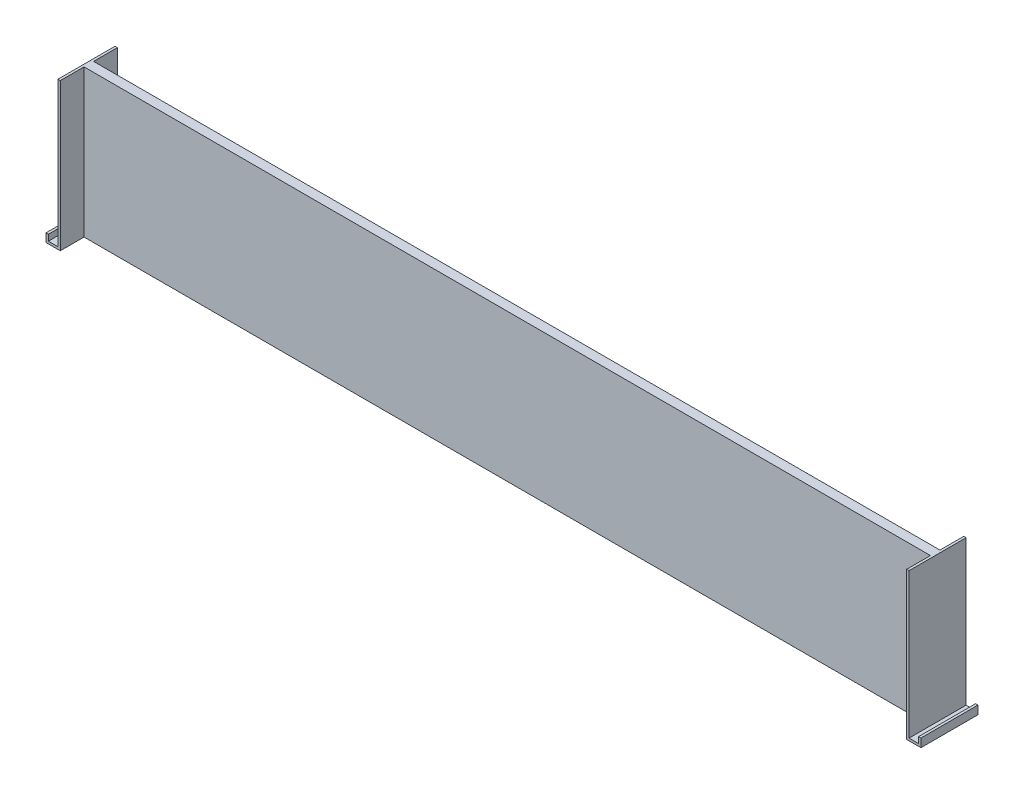
ISO-10303-21;
HEADER;
FILE_DESCRIPTION(('STEP AP214'),'2;1');
FILE_NAME('part.step','',(''),(''),'','','');
FILE_SCHEMA(('AUTOMOTIVE_DESIGN { 1 0 10303 214 1 1 1 1 }'));
ENDSEC;
DATA;
#1=APPLICATION_CONTEXT('core data for automotive mechanical design processes');
#2=APPLICATION_PROTOCOL_DEFINITION('international standard','automotive_design',2000,#1);
#3=PRODUCT_CONTEXT('',#1,'mechanical');
#4=PRODUCT('Part','Part','',(#3));
#5=PRODUCT_RELATED_PRODUCT_CATEGORY('part','',(#4));
#6=PRODUCT_DEFINITION_FORMATION('','',#4);
#7=PRODUCT_DEFINITION_CONTEXT('part definition',#1,'design');
#8=PRODUCT_DEFINITION('design','',#6,#7);
#9=PRODUCT_DEFINITION_SHAPE('','',#8);
#10=(LENGTH_UNIT() NAMED_UNIT(*) SI_UNIT(.MILLI.,.METRE.));
#11=(NAMED_UNIT(*) PLANE_ANGLE_UNIT() SI_UNIT($,.RADIAN.));
#12=(NAMED_UNIT(*) SI_UNIT($,.STERADIAN.) SOLID_ANGLE_UNIT());
#13=UNCERTAINTY_MEASURE_WITH_UNIT(LENGTH_MEASURE(1.E-05),#10,'distance_accuracy_value','');
#14=(GEOMETRIC_REPRESENTATION_CONTEXT(3) GLOBAL_UNCERTAINTY_ASSIGNED_CONTEXT((#13)) GLOBAL_UNIT_ASSIGNED_CONTEXT((#10,
#11,#12)) REPRESENTATION_CONTEXT('',''));
#15=CARTESIAN_POINT('',(0.,0.,0.));
#16=DIRECTION('',(0.,0.,1.));
#17=DIRECTION('',(1.,0.,0.));
#18=AXIS2_PLACEMENT_3D('',#15,#16,#17);
#19=CARTESIAN_POINT('',(-4.7625,49.2125,0.));
#20=DIRECTION('',(-1.,0.,0.));
#21=DIRECTION('',(0.,0.,1.));
#22=AXIS2_PLACEMENT_3D('',#19,#20,#21);
#23=PLANE('',#22);
#24=DIRECTION('',(0.,0.,1.));
#25=VECTOR('',#24,1.);
#26=CARTESIAN_POINT('',(-4.7625,2.8185133302467,-11.1125));
#27=LINE('',#26,#25);
#28=CARTESIAN_POINT('',(-4.7625,2.8185133302467,-11.1125));
#29=VERTEX_POINT('',#28);
#30=CARTESIAN_POINT('',(-4.7625,2.8185133302467,7.9375));
#31=VERTEX_POINT('',#30);
#32=EDGE_CURVE('E230',#29,#31,#27,.T.);
#33=ORIENTED_EDGE('',*,*,#32,.F.);
#34=DIRECTION('',(0.,-1.,0.));
#35=VECTOR('',#34,1.);
#36=CARTESIAN_POINT('',(-4.7625,49.2125,-11.1125));
#37=LINE('',#36,#35);
#38=CARTESIAN_POINT('',(-4.7625,0.,-11.1125));
#39=VERTEX_POINT('',#38);
#40=EDGE_CURVE('E243',#29,#39,#37,.T.);
#41=ORIENTED_EDGE('',*,*,#40,.T.);
#42=DIRECTION('',(0.,0.,-1.));
#43=VECTOR('',#42,1.);
#44=CARTESIAN_POINT('',(-4.7625,0.,0.));
#45=LINE('',#44,#43);
#46=CARTESIAN_POINT('',(-4.7625,0.,7.9375));
#47=VERTEX_POINT('',#46);
#48=EDGE_CURVE('E337',#47,#39,#45,.T.);
#49=ORIENTED_EDGE('',*,*,#48,.F.);
#50=DIRECTION('',(0.,-1.,0.));
#51=VECTOR('',#50,1.);
#52=CARTESIAN_POINT('',(-4.7625,49.2125,7.9375));
#53=LINE('',#52,#51);
#54=EDGE_CURVE('E245',#31,#47,#53,.T.);
#55=ORIENTED_EDGE('',*,*,#54,.F.);
#56=EDGE_LOOP('',(#33,#41,#49,#55));
#57=FACE_BOUND('',#56,.T.);
#58=ADVANCED_FACE('F89',(#57),#23,.T.);
#59=CARTESIAN_POINT('',(0.,49.2125,7.9375));
#60=DIRECTION('',(0.,0.,1.));
#61=DIRECTION('',(1.,0.,0.));
#62=AXIS2_PLACEMENT_3D('',#59,#60,#61);
#63=PLANE('',#62);
#64=DIRECTION('',(0.,1.,0.));
#65=VECTOR('',#64,1.);
#66=CARTESIAN_POINT('',(-0.79375,0.793749999999999,7.9375));
#67=LINE('',#66,#65);
#68=CARTESIAN_POINT('',(-0.79375,0.793749999999999,7.9375));
#69=VERTEX_POINT('',#68);
#70=CARTESIAN_POINT('',(-0.79375,49.2125,7.9375));
#71=VERTEX_POINT('',#70);
#72=EDGE_CURVE('E106',#69,#71,#67,.T.);
#73=ORIENTED_EDGE('',*,*,#72,.F.);
#74=DIRECTION('',(1.,0.,0.));
#75=VECTOR('',#74,1.);
#76=CARTESIAN_POINT('',(-3.96875,0.793749999999999,7.9375));
#77=LINE('',#76,#75);
#78=CARTESIAN_POINT('',(-3.96875,0.793749999999999,7.9375));
#79=VERTEX_POINT('',#78);
#80=EDGE_CURVE('E490',#79,#69,#77,.T.);
#81=ORIENTED_EDGE('',*,*,#80,.F.);
#82=DIRECTION('',(0.,-1.,0.));
#83=VECTOR('',#82,1.);
#84=CARTESIAN_POINT('',(-3.96875,2.8185133302467,7.9375));
#85=LINE('',#84,#83);
#86=CARTESIAN_POINT('',(-3.96875,2.8185133302467,7.9375));
#87=VERTEX_POINT('',#86);
#88=EDGE_CURVE('E494',#87,#79,#85,.T.);
#89=ORIENTED_EDGE('',*,*,#88,.F.);
#90=DIRECTION('',(1.,0.,0.));
#91=VECTOR('',#90,1.);
#92=CARTESIAN_POINT('',(-4.7625,2.8185133302467,7.9375));
#93=LINE('',#92,#91);
#94=EDGE_CURVE('E449',#31,#87,#93,.T.);
#95=ORIENTED_EDGE('',*,*,#94,.F.);
#96=ORIENTED_EDGE('',*,*,#54,.T.);
#97=DIRECTION('',(-1.,0.,0.));
#98=VECTOR('',#97,1.);
#99=CARTESIAN_POINT('',(0.,0.,7.9375));
#100=LINE('',#99,#98);
#101=CARTESIAN_POINT('',(0.,0.,7.9375));
#102=VERTEX_POINT('',#101);
#103=EDGE_CURVE('E341',#102,#47,#100,.T.);
#104=ORIENTED_EDGE('',*,*,#103,.F.);
#105=DIRECTION('',(0.,-1.,0.));
#106=VECTOR('',#105,1.);
#107=CARTESIAN_POINT('',(0.,49.2125,7.9375));
#108=LINE('',#107,#106);
#109=CARTESIAN_POINT('',(0.,49.2125,7.9375));
#110=VERTEX_POINT('',#109);
#111=EDGE_CURVE('E261',#110,#102,#108,.T.);
#112=ORIENTED_EDGE('',*,*,#111,.F.);
#113=DIRECTION('',(-1.,0.,0.));
#114=VECTOR('',#113,1.);
#115=CARTESIAN_POINT('',(0.,49.2125,7.9375));
#116=LINE('',#115,#114);
#117=EDGE_CURVE('E356',#110,#71,#116,.T.);
#118=ORIENTED_EDGE('',*,*,#117,.T.);
#119=EDGE_LOOP('',(#73,#81,#89,#95,#96,#104,#112,#118));
#120=FACE_BOUND('',#119,.T.);
#121=ADVANCED_FACE('F374',(#120),#63,.T.);
#122=CARTESIAN_POINT('',(0.,49.2125,-11.1125));
#123=DIRECTION('',(0.,0.,1.));
#124=DIRECTION('',(1.,0.,0.));
#125=AXIS2_PLACEMENT_3D('',#122,#123,#124);
#126=PLANE('',#125);
#127=DIRECTION('',(1.,0.,0.));
#128=VECTOR('',#127,1.);
#129=CARTESIAN_POINT('',(-3.96875,0.793749999999999,-11.1125));
#130=LINE('',#129,#128);
#131=CARTESIAN_POINT('',(-3.96875,0.793749999999999,-11.1125));
#132=VERTEX_POINT('',#131);
#133=CARTESIAN_POINT('',(-0.79375,0.793749999999999,-11.1125));
#134=VERTEX_POINT('',#133);
#135=EDGE_CURVE('E502',#132,#134,#130,.T.);
#136=ORIENTED_EDGE('',*,*,#135,.T.);
#137=DIRECTION('',(0.,1.,0.));
#138=VECTOR('',#137,1.);
#139=CARTESIAN_POINT('',(-0.79375,0.793749999999999,-11.1125));
#140=LINE('',#139,#138);
#141=CARTESIAN_POINT('',(-0.79375,49.2125,-11.1125));
#142=VERTEX_POINT('',#141);
#143=EDGE_CURVE('E247',#134,#142,#140,.T.);
#144=ORIENTED_EDGE('',*,*,#143,.T.);
#145=DIRECTION('',(-1.,0.,0.));
#146=VECTOR('',#145,1.);
#147=CARTESIAN_POINT('',(0.,49.2125,-11.1125));
#148=LINE('',#147,#146);
#149=CARTESIAN_POINT('',(0.,49.2125,-11.1125));
#150=VERTEX_POINT('',#149);
#151=EDGE_CURVE('E257',#150,#142,#148,.T.);
#152=ORIENTED_EDGE('',*,*,#151,.F.);
#153=DIRECTION('',(0.,-1.,0.));
#154=VECTOR('',#153,1.);
#155=CARTESIAN_POINT('',(0.,49.2125,-11.1125));
#156=LINE('',#155,#154);
#157=CARTESIAN_POINT('',(0.,0.,-11.1125));
#158=VERTEX_POINT('',#157);
#159=EDGE_CURVE('E256',#150,#158,#156,.T.);
#160=ORIENTED_EDGE('',*,*,#159,.T.);
#161=DIRECTION('',(-1.,0.,0.));
#162=VECTOR('',#161,1.);
#163=CARTESIAN_POINT('',(0.,0.,-11.1125));
#164=LINE('',#163,#162);
#165=EDGE_CURVE('E253',#158,#39,#164,.T.);
#166=ORIENTED_EDGE('',*,*,#165,.T.);
#167=ORIENTED_EDGE('',*,*,#40,.F.);
#168=DIRECTION('',(1.,0.,0.));
#169=VECTOR('',#168,1.);
#170=CARTESIAN_POINT('',(-4.7625,2.8185133302467,-11.1125));
#171=LINE('',#170,#169);
#172=CARTESIAN_POINT('',(-3.96875,2.8185133302467,-11.1125));
#173=VERTEX_POINT('',#172);
#174=EDGE_CURVE('E226',#29,#173,#171,.T.);
#175=ORIENTED_EDGE('',*,*,#174,.T.);
#176=DIRECTION('',(0.,-1.,0.));
#177=VECTOR('',#176,1.);
#178=CARTESIAN_POINT('',(-3.96875,2.8185133302467,-11.1125));
#179=LINE('',#178,#177);
#180=EDGE_CURVE('E238',#173,#132,#179,.T.);
#181=ORIENTED_EDGE('',*,*,#180,.T.);
#182=EDGE_LOOP('',(#136,#144,#152,#160,#166,#167,#175,#181));
#183=FACE_BOUND('',#182,.T.);
#184=ADVANCED_FACE('F250',(#183),#126,.F.);
#185=CARTESIAN_POINT('',(0.,0.,0.));
#186=DIRECTION('',(0.,1.,0.));
#187=DIRECTION('',(0.,0.,1.));
#188=AXIS2_PLACEMENT_3D('',#185,#186,#187);
#189=PLANE('',#188);
#190=ORIENTED_EDGE('',*,*,#48,.T.);
#191=ORIENTED_EDGE('',*,*,#165,.F.);
#192=DIRECTION('',(0.,0.,-1.));
#193=VECTOR('',#192,1.);
#194=CARTESIAN_POINT('',(0.,0.,0.));
#195=LINE('',#194,#193);
#196=CARTESIAN_POINT('',(0.,0.,-3.175));
#197=VERTEX_POINT('',#196);
#198=EDGE_CURVE('E346',#197,#158,#195,.T.);
#199=ORIENTED_EDGE('',*,*,#198,.F.);
#200=DIRECTION('',(1.,0.,0.));
#201=VECTOR('',#200,1.);
#202=CARTESIAN_POINT('',(0.,0.,-3.175));
#203=LINE('',#202,#201);
#204=CARTESIAN_POINT('',(282.575,0.,-3.175));
#205=VERTEX_POINT('',#204);
#206=EDGE_CURVE('E326',#197,#205,#203,.T.);
#207=ORIENTED_EDGE('',*,*,#206,.T.);
#208=DIRECTION('',(0.,0.,-1.));
#209=VECTOR('',#208,1.);
#210=CARTESIAN_POINT('',(282.575,0.,0.));
#211=LINE('',#210,#209);
#212=CARTESIAN_POINT('',(282.575,0.,-11.1125));
#213=VERTEX_POINT('',#212);
#214=EDGE_CURVE('E301',#205,#213,#211,.T.);
#215=ORIENTED_EDGE('',*,*,#214,.T.);
#216=DIRECTION('',(1.,0.,0.));
#217=VECTOR('',#216,1.);
#218=CARTESIAN_POINT('',(0.,0.,-11.1125));
#219=LINE('',#218,#217);
#220=CARTESIAN_POINT('',(287.3375,0.,-11.1125));
#221=VERTEX_POINT('',#220);
#222=EDGE_CURVE('E297',#213,#221,#219,.T.);
#223=ORIENTED_EDGE('',*,*,#222,.T.);
#224=DIRECTION('',(0.,0.,-1.));
#225=VECTOR('',#224,1.);
#226=CARTESIAN_POINT('',(287.3375,0.,0.));
#227=LINE('',#226,#225);
#228=CARTESIAN_POINT('',(287.3375,0.,7.9375));
#229=VERTEX_POINT('',#228);
#230=EDGE_CURVE('E292',#229,#221,#227,.T.);
#231=ORIENTED_EDGE('',*,*,#230,.F.);
#232=DIRECTION('',(1.,0.,0.));
#233=VECTOR('',#232,1.);
#234=CARTESIAN_POINT('',(0.,0.,7.9375));
#235=LINE('',#234,#233);
#236=CARTESIAN_POINT('',(282.575,0.,7.9375));
#237=VERTEX_POINT('',#236);
#238=EDGE_CURVE('E288',#237,#229,#235,.T.);
#239=ORIENTED_EDGE('',*,*,#238,.F.);
#240=CARTESIAN_POINT('',(282.575,0.,0.));
#241=VERTEX_POINT('',#240);
#242=EDGE_CURVE('E278',#237,#241,#211,.T.);
#243=ORIENTED_EDGE('',*,*,#242,.T.);
#244=DIRECTION('',(1.,0.,0.));
#245=VECTOR('',#244,1.);
#246=CARTESIAN_POINT('',(0.,0.,0.));
#247=LINE('',#246,#245);
#248=CARTESIAN_POINT('',(0.,0.,0.));
#249=VERTEX_POINT('',#248);
#250=EDGE_CURVE('E322',#249,#241,#247,.T.);
#251=ORIENTED_EDGE('',*,*,#250,.F.);
#252=EDGE_CURVE('E349',#102,#249,#195,.T.);
#253=ORIENTED_EDGE('',*,*,#252,.F.);
#254=ORIENTED_EDGE('',*,*,#103,.T.);
#255=EDGE_LOOP('',(#190,#191,#199,#207,#215,#223,#231,#239,#243,#251,#253,#254));
#256=FACE_BOUND('',#255,.T.);
#257=ADVANCED_FACE('F364',(#256),#189,.F.);
#258=CARTESIAN_POINT('',(0.,49.2125,0.));
#259=DIRECTION('',(0.,1.,0.));
#260=DIRECTION('',(0.,0.,1.));
#261=AXIS2_PLACEMENT_3D('',#258,#259,#260);
#262=PLANE('',#261);
#263=DIRECTION('',(0.,0.,1.));
#264=VECTOR('',#263,1.);
#265=CARTESIAN_POINT('',(-0.79375,49.2125,-11.1125));
#266=LINE('',#265,#264);
#267=EDGE_CURVE('E330',#142,#71,#266,.T.);
#268=ORIENTED_EDGE('',*,*,#267,.T.);
#269=ORIENTED_EDGE('',*,*,#117,.F.);
#270=DIRECTION('',(0.,0.,-1.));
#271=VECTOR('',#270,1.);
#272=CARTESIAN_POINT('',(0.,49.2125,0.));
#273=LINE('',#272,#271);
#274=CARTESIAN_POINT('',(0.,49.2125,0.));
#275=VERTEX_POINT('',#274);
#276=EDGE_CURVE('E264',#110,#275,#273,.T.);
#277=ORIENTED_EDGE('',*,*,#276,.T.);
#278=DIRECTION('',(1.,0.,0.));
#279=VECTOR('',#278,1.);
#280=CARTESIAN_POINT('',(0.,49.2125,0.));
#281=LINE('',#280,#279);
#282=CARTESIAN_POINT('',(282.575,49.2125,0.));
#283=VERTEX_POINT('',#282);
#284=EDGE_CURVE('E293',#275,#283,#281,.T.);
#285=ORIENTED_EDGE('',*,*,#284,.T.);
#286=DIRECTION('',(0.,0.,-1.));
#287=VECTOR('',#286,1.);
#288=CARTESIAN_POINT('',(282.575,49.2125,0.));
#289=LINE('',#288,#287);
#290=CARTESIAN_POINT('',(282.575,49.2125,7.9375));
#291=VERTEX_POINT('',#290);
#292=EDGE_CURVE('E283',#291,#283,#289,.T.);
#293=ORIENTED_EDGE('',*,*,#292,.F.);
#294=DIRECTION('',(1.,0.,0.));
#295=VECTOR('',#294,1.);
#296=CARTESIAN_POINT('',(0.,49.2125,7.9375));
#297=LINE('',#296,#295);
#298=CARTESIAN_POINT('',(283.36875,49.2125,7.9375));
#299=VERTEX_POINT('',#298);
#300=EDGE_CURVE('E273',#291,#299,#297,.T.);
#301=ORIENTED_EDGE('',*,*,#300,.T.);
#302=DIRECTION('',(0.,0.,1.));
#303=VECTOR('',#302,1.);
#304=CARTESIAN_POINT('',(283.36875,49.2125,-11.1125));
#305=LINE('',#304,#303);
#306=CARTESIAN_POINT('',(283.36875,49.2125,-11.1125));
#307=VERTEX_POINT('',#306);
#308=EDGE_CURVE('E432',#307,#299,#305,.T.);
#309=ORIENTED_EDGE('',*,*,#308,.F.);
#310=DIRECTION('',(1.,0.,0.));
#311=VECTOR('',#310,1.);
#312=CARTESIAN_POINT('',(0.,49.2125,-11.1125));
#313=LINE('',#312,#311);
#314=CARTESIAN_POINT('',(282.575,49.2125,-11.1125));
#315=VERTEX_POINT('',#314);
#316=EDGE_CURVE('E277',#315,#307,#313,.T.);
#317=ORIENTED_EDGE('',*,*,#316,.F.);
#318=CARTESIAN_POINT('',(282.575,49.2125,-3.175));
#319=VERTEX_POINT('',#318);
#320=EDGE_CURVE('E282',#319,#315,#289,.T.);
#321=ORIENTED_EDGE('',*,*,#320,.F.);
#322=DIRECTION('',(1.,0.,0.));
#323=VECTOR('',#322,1.);
#324=CARTESIAN_POINT('',(0.,49.2125,-3.175));
#325=LINE('',#324,#323);
#326=CARTESIAN_POINT('',(0.,49.2125,-3.175));
#327=VERTEX_POINT('',#326);
#328=EDGE_CURVE('E318',#327,#319,#325,.T.);
#329=ORIENTED_EDGE('',*,*,#328,.F.);
#330=EDGE_CURVE('E427',#327,#150,#273,.T.);
#331=ORIENTED_EDGE('',*,*,#330,.T.);
#332=ORIENTED_EDGE('',*,*,#151,.T.);
#333=EDGE_LOOP('',(#268,#269,#277,#285,#293,#301,#309,#317,#321,#329,#331,#332));
#334=FACE_BOUND('',#333,.T.);
#335=ADVANCED_FACE('F366',(#334),#262,.T.);
#336=CARTESIAN_POINT('',(0.,49.2125,0.));
#337=DIRECTION('',(-1.,0.,0.));
#338=DIRECTION('',(0.,0.,1.));
#339=AXIS2_PLACEMENT_3D('',#336,#337,#338);
#340=PLANE('',#339);
#341=ORIENTED_EDGE('',*,*,#330,.F.);
#342=DIRECTION('',(0.,-1.,0.));
#343=VECTOR('',#342,1.);
#344=CARTESIAN_POINT('',(0.,49.2125,-3.175));
#345=LINE('',#344,#343);
#346=EDGE_CURVE('E93',#327,#197,#345,.T.);
#347=ORIENTED_EDGE('',*,*,#346,.T.);
#348=ORIENTED_EDGE('',*,*,#198,.T.);
#349=ORIENTED_EDGE('',*,*,#159,.F.);
#350=EDGE_LOOP('',(#341,#347,#348,#349));
#351=FACE_BOUND('',#350,.T.);
#352=ADVANCED_FACE('F361',(#351),#340,.F.);
#353=DIRECTION('',(0.,-1.,0.));
#354=VECTOR('',#353,1.);
#355=CARTESIAN_POINT('',(0.,49.2125,0.));
#356=LINE('',#355,#354);
#357=EDGE_CURVE('E12',#275,#249,#356,.T.);
#358=ORIENTED_EDGE('',*,*,#357,.F.);
#359=ORIENTED_EDGE('',*,*,#276,.F.);
#360=ORIENTED_EDGE('',*,*,#111,.T.);
#361=ORIENTED_EDGE('',*,*,#252,.T.);
#362=EDGE_LOOP('',(#358,#359,#360,#361));
#363=FACE_BOUND('',#362,.T.);
#364=ADVANCED_FACE('F399',(#363),#340,.F.);
#365=CARTESIAN_POINT('',(287.3375,49.2125,0.));
#366=DIRECTION('',(-1.,0.,0.));
#367=DIRECTION('',(0.,0.,1.));
#368=AXIS2_PLACEMENT_3D('',#365,#366,#367);
#369=PLANE('',#368);
#370=DIRECTION('',(0.,-1.,0.));
#371=VECTOR('',#370,1.);
#372=CARTESIAN_POINT('',(287.3375,49.2125,-11.1125));
#373=LINE('',#372,#371);
#374=CARTESIAN_POINT('',(287.3375,2.8185133302467,-11.1125));
#375=VERTEX_POINT('',#374);
#376=EDGE_CURVE('E311',#375,#221,#373,.T.);
#377=ORIENTED_EDGE('',*,*,#376,.F.);
#378=DIRECTION('',(0.,0.,1.));
#379=VECTOR('',#378,1.);
#380=CARTESIAN_POINT('',(287.3375,2.8185133302467,-11.1125));
#381=LINE('',#380,#379);
#382=CARTESIAN_POINT('',(287.3375,2.8185133302467,7.9375));
#383=VERTEX_POINT('',#382);
#384=EDGE_CURVE('E445',#375,#383,#381,.T.);
#385=ORIENTED_EDGE('',*,*,#384,.T.);
#386=DIRECTION('',(0.,-1.,0.));
#387=VECTOR('',#386,1.);
#388=CARTESIAN_POINT('',(287.3375,49.2125,7.9375));
#389=LINE('',#388,#387);
#390=EDGE_CURVE('E314',#383,#229,#389,.T.);
#391=ORIENTED_EDGE('',*,*,#390,.T.);
#392=ORIENTED_EDGE('',*,*,#230,.T.);
#393=EDGE_LOOP('',(#377,#385,#391,#392));
#394=FACE_BOUND('',#393,.T.);
#395=ADVANCED_FACE('F396',(#394),#369,.F.);
#396=CARTESIAN_POINT('',(0.,49.2125,7.9375));
#397=DIRECTION('',(0.,0.,-1.));
#398=DIRECTION('',(-1.,0.,0.));
#399=AXIS2_PLACEMENT_3D('',#396,#397,#398);
#400=PLANE('',#399);
#401=ORIENTED_EDGE('',*,*,#390,.F.);
#402=DIRECTION('',(1.,0.,0.));
#403=VECTOR('',#402,1.);
#404=CARTESIAN_POINT('',(287.3375,2.8185133302467,7.9375));
#405=LINE('',#404,#403);
#406=CARTESIAN_POINT('',(286.54375,2.8185133302467,7.9375));
#407=VERTEX_POINT('',#406);
#408=EDGE_CURVE('E450',#407,#383,#405,.T.);
#409=ORIENTED_EDGE('',*,*,#408,.F.);
#410=DIRECTION('',(0.,1.,0.));
#411=VECTOR('',#410,1.);
#412=CARTESIAN_POINT('',(286.54375,2.8185133302467,7.9375));
#413=LINE('',#412,#411);
#414=CARTESIAN_POINT('',(286.54375,0.793750000000007,7.9375));
#415=VERTEX_POINT('',#414);
#416=EDGE_CURVE('E454',#415,#407,#413,.T.);
#417=ORIENTED_EDGE('',*,*,#416,.F.);
#418=DIRECTION('',(1.,0.,0.));
#419=VECTOR('',#418,1.);
#420=CARTESIAN_POINT('',(286.54375,0.793750000000007,7.9375));
#421=LINE('',#420,#419);
#422=CARTESIAN_POINT('',(283.36875,0.793750000000007,7.9375));
#423=VERTEX_POINT('',#422);
#424=EDGE_CURVE('E458',#423,#415,#421,.T.);
#425=ORIENTED_EDGE('',*,*,#424,.F.);
#426=DIRECTION('',(0.,-1.,0.));
#427=VECTOR('',#426,1.);
#428=CARTESIAN_POINT('',(283.36875,0.793750000000007,7.9375));
#429=LINE('',#428,#427);
#430=EDGE_CURVE('E462',#299,#423,#429,.T.);
#431=ORIENTED_EDGE('',*,*,#430,.F.);
#432=ORIENTED_EDGE('',*,*,#300,.F.);
#433=DIRECTION('',(0.,-1.,0.));
#434=VECTOR('',#433,1.);
#435=CARTESIAN_POINT('',(282.575,49.2125,7.9375));
#436=LINE('',#435,#434);
#437=EDGE_CURVE('E287',#291,#237,#436,.T.);
#438=ORIENTED_EDGE('',*,*,#437,.T.);
#439=ORIENTED_EDGE('',*,*,#238,.T.);
#440=EDGE_LOOP('',(#401,#409,#417,#425,#431,#432,#438,#439));
#441=FACE_BOUND('',#440,.T.);
#442=ADVANCED_FACE('F394',(#441),#400,.F.);
#443=CARTESIAN_POINT('',(0.,49.2125,-11.1125));
#444=DIRECTION('',(0.,0.,-1.));
#445=DIRECTION('',(-1.,0.,0.));
#446=AXIS2_PLACEMENT_3D('',#443,#444,#445);
#447=PLANE('',#446);
#448=DIRECTION('',(1.,0.,0.));
#449=VECTOR('',#448,1.);
#450=CARTESIAN_POINT('',(287.3375,2.8185133302467,-11.1125));
#451=LINE('',#450,#449);
#452=CARTESIAN_POINT('',(286.54375,2.8185133302467,-11.1125));
#453=VERTEX_POINT('',#452);
#454=EDGE_CURVE('E436',#453,#375,#451,.T.);
#455=ORIENTED_EDGE('',*,*,#454,.T.);
#456=ORIENTED_EDGE('',*,*,#376,.T.);
#457=ORIENTED_EDGE('',*,*,#222,.F.);
#458=DIRECTION('',(0.,-1.,0.));
#459=VECTOR('',#458,1.);
#460=CARTESIAN_POINT('',(282.575,49.2125,-11.1125));
#461=LINE('',#460,#459);
#462=EDGE_CURVE('E307',#315,#213,#461,.T.);
#463=ORIENTED_EDGE('',*,*,#462,.F.);
#464=ORIENTED_EDGE('',*,*,#316,.T.);
#465=DIRECTION('',(0.,-1.,0.));
#466=VECTOR('',#465,1.);
#467=CARTESIAN_POINT('',(283.36875,0.793750000000007,-11.1125));
#468=LINE('',#467,#466);
#469=CARTESIAN_POINT('',(283.36875,0.79375000000001,-11.1125));
#470=VERTEX_POINT('',#469);
#471=EDGE_CURVE('E453',#307,#470,#468,.T.);
#472=ORIENTED_EDGE('',*,*,#471,.T.);
#473=DIRECTION('',(1.,0.,0.));
#474=VECTOR('',#473,1.);
#475=CARTESIAN_POINT('',(286.54375,0.793750000000007,-11.1125));
#476=LINE('',#475,#474);
#477=CARTESIAN_POINT('',(286.54375,0.793750000000007,-11.1125));
#478=VERTEX_POINT('',#477);
#479=EDGE_CURVE('E114',#470,#478,#476,.T.);
#480=ORIENTED_EDGE('',*,*,#479,.T.);
#481=DIRECTION('',(0.,1.,0.));
#482=VECTOR('',#481,1.);
#483=CARTESIAN_POINT('',(286.54375,2.8185133302467,-11.1125));
#484=LINE('',#483,#482);
#485=EDGE_CURVE('E469',#478,#453,#484,.T.);
#486=ORIENTED_EDGE('',*,*,#485,.T.);
#487=EDGE_LOOP('',(#455,#456,#457,#463,#464,#472,#480,#486));
#488=FACE_BOUND('',#487,.T.);
#489=ADVANCED_FACE('F391',(#488),#447,.T.);
#490=CARTESIAN_POINT('',(282.575,49.2125,0.));
#491=DIRECTION('',(-1.,0.,0.));
#492=DIRECTION('',(0.,0.,1.));
#493=AXIS2_PLACEMENT_3D('',#490,#491,#492);
#494=PLANE('',#493);
#495=ORIENTED_EDGE('',*,*,#292,.T.);
#496=DIRECTION('',(0.,-1.,0.));
#497=VECTOR('',#496,1.);
#498=CARTESIAN_POINT('',(282.575,49.2125,0.));
#499=LINE('',#498,#497);
#500=EDGE_CURVE('E317',#283,#241,#499,.T.);
#501=ORIENTED_EDGE('',*,*,#500,.T.);
#502=ORIENTED_EDGE('',*,*,#242,.F.);
#503=ORIENTED_EDGE('',*,*,#437,.F.);
#504=EDGE_LOOP('',(#495,#501,#502,#503));
#505=FACE_BOUND('',#504,.T.);
#506=ADVANCED_FACE('F388',(#505),#494,.T.);
#507=DIRECTION('',(0.,-1.,0.));
#508=VECTOR('',#507,1.);
#509=CARTESIAN_POINT('',(282.575,49.2125,-3.175));
#510=LINE('',#509,#508);
#511=EDGE_CURVE('E335',#319,#205,#510,.T.);
#512=ORIENTED_EDGE('',*,*,#511,.F.);
#513=ORIENTED_EDGE('',*,*,#320,.T.);
#514=ORIENTED_EDGE('',*,*,#462,.T.);
#515=ORIENTED_EDGE('',*,*,#214,.F.);
#516=EDGE_LOOP('',(#512,#513,#514,#515));
#517=FACE_BOUND('',#516,.T.);
#518=ADVANCED_FACE('F385',(#517),#494,.T.);
#519=CARTESIAN_POINT('',(0.,49.2125,-3.175));
#520=DIRECTION('',(0.,0.,-1.));
#521=DIRECTION('',(-1.,0.,0.));
#522=AXIS2_PLACEMENT_3D('',#519,#520,#521);
#523=PLANE('',#522);
#524=ORIENTED_EDGE('',*,*,#206,.F.);
#525=ORIENTED_EDGE('',*,*,#346,.F.);
#526=ORIENTED_EDGE('',*,*,#328,.T.);
#527=ORIENTED_EDGE('',*,*,#511,.T.);
#528=EDGE_LOOP('',(#524,#525,#526,#527));
#529=FACE_BOUND('',#528,.T.);
#530=ADVANCED_FACE('F91',(#529),#523,.T.);
#531=CARTESIAN_POINT('',(0.,49.2125,0.));
#532=DIRECTION('',(0.,0.,-1.));
#533=DIRECTION('',(-1.,0.,0.));
#534=AXIS2_PLACEMENT_3D('',#531,#532,#533);
#535=PLANE('',#534);
#536=ORIENTED_EDGE('',*,*,#250,.T.);
#537=ORIENTED_EDGE('',*,*,#500,.F.);
#538=ORIENTED_EDGE('',*,*,#284,.F.);
#539=ORIENTED_EDGE('',*,*,#357,.T.);
#540=EDGE_LOOP('',(#536,#537,#538,#539));
#541=FACE_BOUND('',#540,.T.);
#542=ADVANCED_FACE('F390',(#541),#535,.F.);
#543=CARTESIAN_POINT('',(287.3375,2.8185133302467,-11.1125));
#544=DIRECTION('',(0.,-1.,0.));
#545=DIRECTION('',(0.,0.,-1.));
#546=AXIS2_PLACEMENT_3D('',#543,#544,#545);
#547=PLANE('',#546);
#548=ORIENTED_EDGE('',*,*,#408,.T.);
#549=ORIENTED_EDGE('',*,*,#384,.F.);
#550=ORIENTED_EDGE('',*,*,#454,.F.);
#551=DIRECTION('',(0.,0.,1.));
#552=VECTOR('',#551,1.);
#553=CARTESIAN_POINT('',(286.54375,2.8185133302467,-11.1125));
#554=LINE('',#553,#552);
#555=EDGE_CURVE('E442',#453,#407,#554,.T.);
#556=ORIENTED_EDGE('',*,*,#555,.T.);
#557=EDGE_LOOP('',(#548,#549,#550,#556));
#558=FACE_BOUND('',#557,.T.);
#559=ADVANCED_FACE('F404',(#558),#547,.F.);
#560=CARTESIAN_POINT('',(286.54375,2.8185133302467,-11.1125));
#561=DIRECTION('',(1.,0.,0.));
#562=DIRECTION('',(0.,0.,-1.));
#563=AXIS2_PLACEMENT_3D('',#560,#561,#562);
#564=PLANE('',#563);
#565=ORIENTED_EDGE('',*,*,#416,.T.);
#566=ORIENTED_EDGE('',*,*,#555,.F.);
#567=ORIENTED_EDGE('',*,*,#485,.F.);
#568=DIRECTION('',(0.,0.,1.));
#569=VECTOR('',#568,1.);
#570=CARTESIAN_POINT('',(286.54375,0.793750000000007,-11.1125));
#571=LINE('',#570,#569);
#572=EDGE_CURVE('E439',#478,#415,#571,.T.);
#573=ORIENTED_EDGE('',*,*,#572,.T.);
#574=EDGE_LOOP('',(#565,#566,#567,#573));
#575=FACE_BOUND('',#574,.T.);
#576=ADVANCED_FACE('F410',(#575),#564,.F.);
#577=CARTESIAN_POINT('',(286.54375,0.793750000000007,-11.1125));
#578=DIRECTION('',(0.,-1.,0.));
#579=DIRECTION('',(0.,0.,-1.));
#580=AXIS2_PLACEMENT_3D('',#577,#578,#579);
#581=PLANE('',#580);
#582=ORIENTED_EDGE('',*,*,#424,.T.);
#583=ORIENTED_EDGE('',*,*,#572,.F.);
#584=ORIENTED_EDGE('',*,*,#479,.F.);
#585=DIRECTION('',(0.,0.,1.));
#586=VECTOR('',#585,1.);
#587=CARTESIAN_POINT('',(283.36875,0.793750000000007,-11.1125));
#588=LINE('',#587,#586);
#589=EDGE_CURVE('E435',#470,#423,#588,.T.);
#590=ORIENTED_EDGE('',*,*,#589,.T.);
#591=EDGE_LOOP('',(#582,#583,#584,#590));
#592=FACE_BOUND('',#591,.T.);
#593=ADVANCED_FACE('F531',(#592),#581,.F.);
#594=CARTESIAN_POINT('',(283.36875,0.793750000000007,-11.1125));
#595=DIRECTION('',(-1.,0.,0.));
#596=DIRECTION('',(0.,0.,1.));
#597=AXIS2_PLACEMENT_3D('',#594,#595,#596);
#598=PLANE('',#597);
#599=ORIENTED_EDGE('',*,*,#430,.T.);
#600=ORIENTED_EDGE('',*,*,#589,.F.);
#601=ORIENTED_EDGE('',*,*,#471,.F.);
#602=ORIENTED_EDGE('',*,*,#308,.T.);
#603=EDGE_LOOP('',(#599,#600,#601,#602));
#604=FACE_BOUND('',#603,.T.);
#605=ADVANCED_FACE('F526',(#604),#598,.F.);
#606=CARTESIAN_POINT('',(-0.79375,0.793749999999999,-11.1125));
#607=DIRECTION('',(1.,0.,0.));
#608=DIRECTION('',(0.,0.,-1.));
#609=AXIS2_PLACEMENT_3D('',#606,#607,#608);
#610=PLANE('',#609);
#611=ORIENTED_EDGE('',*,*,#72,.T.);
#612=ORIENTED_EDGE('',*,*,#267,.F.);
#613=ORIENTED_EDGE('',*,*,#143,.F.);
#614=DIRECTION('',(0.,0.,1.));
#615=VECTOR('',#614,1.);
#616=CARTESIAN_POINT('',(-0.79375,0.793749999999999,-11.1125));
#617=LINE('',#616,#615);
#618=EDGE_CURVE('E483',#134,#69,#617,.T.);
#619=ORIENTED_EDGE('',*,*,#618,.T.);
#620=EDGE_LOOP('',(#611,#612,#613,#619));
#621=FACE_BOUND('',#620,.T.);
#622=ADVANCED_FACE('F514',(#621),#610,.F.);
#623=CARTESIAN_POINT('',(-3.96875,0.793749999999999,-11.1125));
#624=DIRECTION('',(0.,-1.,0.));
#625=DIRECTION('',(0.,0.,-1.));
#626=AXIS2_PLACEMENT_3D('',#623,#624,#625);
#627=PLANE('',#626);
#628=ORIENTED_EDGE('',*,*,#80,.T.);
#629=ORIENTED_EDGE('',*,*,#618,.F.);
#630=ORIENTED_EDGE('',*,*,#135,.F.);
#631=DIRECTION('',(0.,0.,1.));
#632=VECTOR('',#631,1.);
#633=CARTESIAN_POINT('',(-3.96875,0.793749999999999,-11.1125));
#634=LINE('',#633,#632);
#635=EDGE_CURVE('E480',#132,#79,#634,.T.);
#636=ORIENTED_EDGE('',*,*,#635,.T.);
#637=EDGE_LOOP('',(#628,#629,#630,#636));
#638=FACE_BOUND('',#637,.T.);
#639=ADVANCED_FACE('F512',(#638),#627,.F.);
#640=CARTESIAN_POINT('',(-3.96875,2.8185133302467,-11.1125));
#641=DIRECTION('',(-1.,0.,0.));
#642=DIRECTION('',(0.,0.,1.));
#643=AXIS2_PLACEMENT_3D('',#640,#641,#642);
#644=PLANE('',#643);
#645=ORIENTED_EDGE('',*,*,#88,.T.);
#646=ORIENTED_EDGE('',*,*,#635,.F.);
#647=ORIENTED_EDGE('',*,*,#180,.F.);
#648=DIRECTION('',(0.,0.,1.));
#649=VECTOR('',#648,1.);
#650=CARTESIAN_POINT('',(-3.96875,2.8185133302467,-11.1125));
#651=LINE('',#650,#649);
#652=EDGE_CURVE('E232',#173,#87,#651,.T.);
#653=ORIENTED_EDGE('',*,*,#652,.T.);
#654=EDGE_LOOP('',(#645,#646,#647,#653));
#655=FACE_BOUND('',#654,.T.);
#656=ADVANCED_FACE('F508',(#655),#644,.F.);
#657=CARTESIAN_POINT('',(-4.7625,2.8185133302467,-11.1125));
#658=DIRECTION('',(0.,-1.,0.));
#659=DIRECTION('',(0.,0.,-1.));
#660=AXIS2_PLACEMENT_3D('',#657,#658,#659);
#661=PLANE('',#660);
#662=ORIENTED_EDGE('',*,*,#94,.T.);
#663=ORIENTED_EDGE('',*,*,#652,.F.);
#664=ORIENTED_EDGE('',*,*,#174,.F.);
#665=ORIENTED_EDGE('',*,*,#32,.T.);
#666=EDGE_LOOP('',(#662,#663,#664,#665));
#667=FACE_BOUND('',#666,.T.);
#668=ADVANCED_FACE('F229',(#667),#661,.F.);
#669=CLOSED_SHELL('',(#58,#121,#184,#257,#335,#352,#364,#395,#442,#489,#506,#518,#530,#542,#559,
#576,#593,#605,#622,#639,#656,#668));
#670=MANIFOLD_SOLID_BREP('B2',#669);
#671=ADVANCED_BREP_SHAPE_REPRESENTATION('',(#18,#670),#14);
#672=SHAPE_DEFINITION_REPRESENTATION(#9,#671);
ENDSEC;
END-ISO-10303-21;
